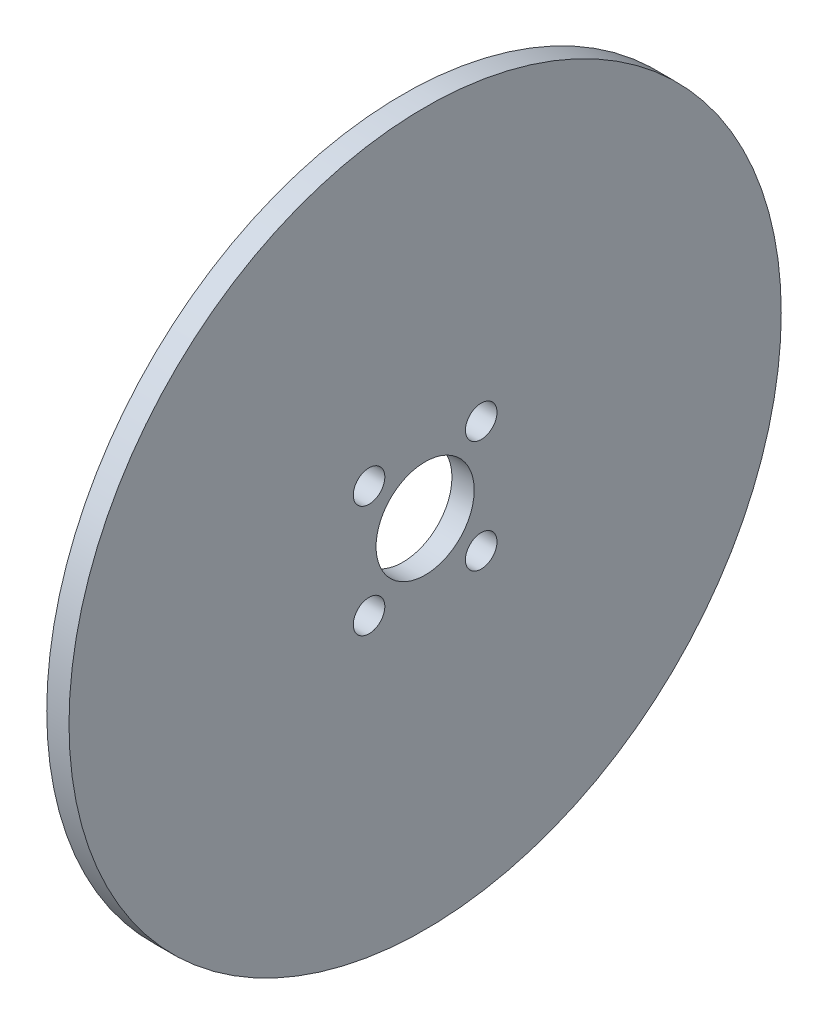
ISO-10303-21;
HEADER;
FILE_DESCRIPTION(('STEP AP214'),'2;1');
FILE_NAME('part.step','',(''),(''),'','','');
FILE_SCHEMA(('AUTOMOTIVE_DESIGN { 1 0 10303 214 1 1 1 1 }'));
ENDSEC;
DATA;
#1=APPLICATION_CONTEXT('core data for automotive mechanical design processes');
#2=APPLICATION_PROTOCOL_DEFINITION('international standard','automotive_design',2000,#1);
#3=PRODUCT_CONTEXT('',#1,'mechanical');
#4=PRODUCT('Part','Part','',(#3));
#5=PRODUCT_RELATED_PRODUCT_CATEGORY('part','',(#4));
#6=PRODUCT_DEFINITION_FORMATION('','',#4);
#7=PRODUCT_DEFINITION_CONTEXT('part definition',#1,'design');
#8=PRODUCT_DEFINITION('design','',#6,#7);
#9=PRODUCT_DEFINITION_SHAPE('','',#8);
#10=(LENGTH_UNIT() NAMED_UNIT(*) SI_UNIT(.MILLI.,.METRE.));
#11=(NAMED_UNIT(*) PLANE_ANGLE_UNIT() SI_UNIT($,.RADIAN.));
#12=(NAMED_UNIT(*) SI_UNIT($,.STERADIAN.) SOLID_ANGLE_UNIT());
#13=UNCERTAINTY_MEASURE_WITH_UNIT(LENGTH_MEASURE(1.E-05),#10,'distance_accuracy_value','');
#14=(GEOMETRIC_REPRESENTATION_CONTEXT(3) GLOBAL_UNCERTAINTY_ASSIGNED_CONTEXT((#13)) GLOBAL_UNIT_ASSIGNED_CONTEXT((#10,
#11,#12)) REPRESENTATION_CONTEXT('',''));
#15=CARTESIAN_POINT('',(0.,0.,0.));
#16=DIRECTION('',(0.,0.,1.));
#17=DIRECTION('',(1.,0.,0.));
#18=AXIS2_PLACEMENT_3D('',#15,#16,#17);
#19=CARTESIAN_POINT('',(3.175,0.,0.));
#20=DIRECTION('',(1.,0.,0.));
#21=DIRECTION('',(0.,0.,-1.));
#22=AXIS2_PLACEMENT_3D('',#19,#20,#21);
#23=PLANE('',#22);
#24=CARTESIAN_POINT('',(3.175,-8.,-8.));
#25=DIRECTION('',(1.,0.,0.));
#26=DIRECTION('',(0.,0.,-1.));
#27=AXIS2_PLACEMENT_3D('',#24,#25,#26);
#28=CIRCLE('',#27,2.25);
#29=CARTESIAN_POINT('',(3.175,-8.,-10.25));
#30=VERTEX_POINT('',#29);
#31=EDGE_CURVE('E65',#30,#30,#28,.T.);
#32=ORIENTED_EDGE('',*,*,#31,.F.);
#33=EDGE_LOOP('',(#32));
#34=FACE_BOUND('',#33,.T.);
#35=CARTESIAN_POINT('',(3.175,8.,-8.));
#36=DIRECTION('',(1.,0.,0.));
#37=DIRECTION('',(0.,0.,-1.));
#38=AXIS2_PLACEMENT_3D('',#35,#36,#37);
#39=CIRCLE('',#38,2.25);
#40=CARTESIAN_POINT('',(3.175,8.,-10.25));
#41=VERTEX_POINT('',#40);
#42=EDGE_CURVE('E71',#41,#41,#39,.T.);
#43=ORIENTED_EDGE('',*,*,#42,.F.);
#44=EDGE_LOOP('',(#43));
#45=FACE_BOUND('',#44,.T.);
#46=CARTESIAN_POINT('',(3.175,8.,8.));
#47=DIRECTION('',(1.,0.,0.));
#48=DIRECTION('',(0.,0.,-1.));
#49=AXIS2_PLACEMENT_3D('',#46,#47,#48);
#50=CIRCLE('',#49,2.25);
#51=CARTESIAN_POINT('',(3.175,8.,5.75));
#52=VERTEX_POINT('',#51);
#53=EDGE_CURVE('E59',#52,#52,#50,.T.);
#54=ORIENTED_EDGE('',*,*,#53,.F.);
#55=EDGE_LOOP('',(#54));
#56=FACE_BOUND('',#55,.T.);
#57=CARTESIAN_POINT('',(3.175,-8.,8.));
#58=DIRECTION('',(1.,0.,0.));
#59=DIRECTION('',(0.,0.,-1.));
#60=AXIS2_PLACEMENT_3D('',#57,#58,#59);
#61=CIRCLE('',#60,2.25);
#62=CARTESIAN_POINT('',(3.175,-8.,5.75));
#63=VERTEX_POINT('',#62);
#64=EDGE_CURVE('E56',#63,#63,#61,.T.);
#65=ORIENTED_EDGE('',*,*,#64,.F.);
#66=EDGE_LOOP('',(#65));
#67=FACE_BOUND('',#66,.T.);
#68=CARTESIAN_POINT('',(3.175,0.,0.));
#69=DIRECTION('',(1.,0.,0.));
#70=DIRECTION('',(0.,0.,-1.));
#71=AXIS2_PLACEMENT_3D('',#68,#69,#70);
#72=CIRCLE('',#71,50.8);
#73=CARTESIAN_POINT('',(3.175,0.,-50.8));
#74=VERTEX_POINT('',#73);
#75=EDGE_CURVE('E10',#74,#74,#72,.T.);
#76=ORIENTED_EDGE('',*,*,#75,.T.);
#77=EDGE_LOOP('',(#76));
#78=FACE_BOUND('',#77,.T.);
#79=CARTESIAN_POINT('',(3.175,0.,0.));
#80=DIRECTION('',(1.,0.,0.));
#81=DIRECTION('',(0.,0.,-1.));
#82=AXIS2_PLACEMENT_3D('',#79,#80,#81);
#83=CIRCLE('',#82,7.);
#84=CARTESIAN_POINT('',(3.175,0.,-7.));
#85=VERTEX_POINT('',#84);
#86=EDGE_CURVE('E48',#85,#85,#83,.T.);
#87=ORIENTED_EDGE('',*,*,#86,.F.);
#88=EDGE_LOOP('',(#87));
#89=FACE_BOUND('',#88,.T.);
#90=ADVANCED_FACE('F37',(#34,#45,#56,#67,#78,#89),#23,.T.);
#91=CARTESIAN_POINT('',(0.,0.,0.));
#92=DIRECTION('',(1.,0.,0.));
#93=DIRECTION('',(0.,0.,-1.));
#94=AXIS2_PLACEMENT_3D('',#91,#92,#93);
#95=PLANE('',#94);
#96=CARTESIAN_POINT('',(0.,-8.,-8.));
#97=DIRECTION('',(1.,0.,0.));
#98=DIRECTION('',(0.,0.,-1.));
#99=AXIS2_PLACEMENT_3D('',#96,#97,#98);
#100=CIRCLE('',#99,2.25);
#101=CARTESIAN_POINT('',(0.,-8.,-10.25));
#102=VERTEX_POINT('',#101);
#103=EDGE_CURVE('E62',#102,#102,#100,.T.);
#104=ORIENTED_EDGE('',*,*,#103,.T.);
#105=EDGE_LOOP('',(#104));
#106=FACE_BOUND('',#105,.T.);
#107=CARTESIAN_POINT('',(0.,8.,-8.));
#108=DIRECTION('',(1.,0.,0.));
#109=DIRECTION('',(0.,0.,-1.));
#110=AXIS2_PLACEMENT_3D('',#107,#108,#109);
#111=CIRCLE('',#110,2.25);
#112=CARTESIAN_POINT('',(0.,8.,-10.25));
#113=VERTEX_POINT('',#112);
#114=EDGE_CURVE('E68',#113,#113,#111,.T.);
#115=ORIENTED_EDGE('',*,*,#114,.T.);
#116=EDGE_LOOP('',(#115));
#117=FACE_BOUND('',#116,.T.);
#118=CARTESIAN_POINT('',(0.,8.,8.));
#119=DIRECTION('',(1.,0.,0.));
#120=DIRECTION('',(0.,0.,-1.));
#121=AXIS2_PLACEMENT_3D('',#118,#119,#120);
#122=CIRCLE('',#121,2.25);
#123=CARTESIAN_POINT('',(0.,8.,5.75));
#124=VERTEX_POINT('',#123);
#125=EDGE_CURVE('E74',#124,#124,#122,.T.);
#126=ORIENTED_EDGE('',*,*,#125,.T.);
#127=EDGE_LOOP('',(#126));
#128=FACE_BOUND('',#127,.T.);
#129=CARTESIAN_POINT('',(0.,-8.,8.));
#130=DIRECTION('',(1.,0.,0.));
#131=DIRECTION('',(0.,0.,-1.));
#132=AXIS2_PLACEMENT_3D('',#129,#130,#131);
#133=CIRCLE('',#132,2.25);
#134=CARTESIAN_POINT('',(0.,-8.,5.75));
#135=VERTEX_POINT('',#134);
#136=EDGE_CURVE('E53',#135,#135,#133,.T.);
#137=ORIENTED_EDGE('',*,*,#136,.T.);
#138=EDGE_LOOP('',(#137));
#139=FACE_BOUND('',#138,.T.);
#140=CARTESIAN_POINT('',(0.,0.,0.));
#141=DIRECTION('',(1.,0.,0.));
#142=DIRECTION('',(0.,0.,-1.));
#143=AXIS2_PLACEMENT_3D('',#140,#141,#142);
#144=CIRCLE('',#143,50.8);
#145=CARTESIAN_POINT('',(0.,0.,-50.8));
#146=VERTEX_POINT('',#145);
#147=EDGE_CURVE('E41',#146,#146,#144,.T.);
#148=ORIENTED_EDGE('',*,*,#147,.F.);
#149=EDGE_LOOP('',(#148));
#150=FACE_BOUND('',#149,.T.);
#151=CARTESIAN_POINT('',(0.,0.,0.));
#152=DIRECTION('',(1.,0.,0.));
#153=DIRECTION('',(0.,0.,-1.));
#154=AXIS2_PLACEMENT_3D('',#151,#152,#153);
#155=CIRCLE('',#154,7.);
#156=CARTESIAN_POINT('',(0.,0.,-7.));
#157=VERTEX_POINT('',#156);
#158=EDGE_CURVE('E50',#157,#157,#155,.T.);
#159=ORIENTED_EDGE('',*,*,#158,.T.);
#160=EDGE_LOOP('',(#159));
#161=FACE_BOUND('',#160,.T.);
#162=ADVANCED_FACE('F84',(#106,#117,#128,#139,#150,#161),#95,.F.);
#163=CARTESIAN_POINT('',(3.175,0.,0.));
#164=DIRECTION('',(-1.,0.,0.));
#165=DIRECTION('',(0.,0.,1.));
#166=AXIS2_PLACEMENT_3D('',#163,#164,#165);
#167=CYLINDRICAL_SURFACE('',#166,50.8);
#168=ORIENTED_EDGE('',*,*,#75,.F.);
#169=EDGE_LOOP('',(#168));
#170=FACE_BOUND('',#169,.T.);
#171=ORIENTED_EDGE('',*,*,#147,.T.);
#172=EDGE_LOOP('',(#171));
#173=FACE_BOUND('',#172,.T.);
#174=ADVANCED_FACE('F39',(#170,#173),#167,.T.);
#175=CARTESIAN_POINT('',(3.175,0.,0.));
#176=DIRECTION('',(-1.,0.,0.));
#177=DIRECTION('',(0.,0.,1.));
#178=AXIS2_PLACEMENT_3D('',#175,#176,#177);
#179=CYLINDRICAL_SURFACE('',#178,7.);
#180=ORIENTED_EDGE('',*,*,#86,.T.);
#181=EDGE_LOOP('',(#180));
#182=FACE_BOUND('',#181,.T.);
#183=ORIENTED_EDGE('',*,*,#158,.F.);
#184=EDGE_LOOP('',(#183));
#185=FACE_BOUND('',#184,.T.);
#186=ADVANCED_FACE('F91',(#182,#185),#179,.F.);
#187=CARTESIAN_POINT('',(0.,-8.,8.));
#188=DIRECTION('',(1.,0.,0.));
#189=DIRECTION('',(0.,0.,-1.));
#190=AXIS2_PLACEMENT_3D('',#187,#188,#189);
#191=CYLINDRICAL_SURFACE('',#190,2.25);
#192=ORIENTED_EDGE('',*,*,#136,.F.);
#193=EDGE_LOOP('',(#192));
#194=FACE_BOUND('',#193,.T.);
#195=ORIENTED_EDGE('',*,*,#64,.T.);
#196=EDGE_LOOP('',(#195));
#197=FACE_BOUND('',#196,.T.);
#198=ADVANCED_FACE('F94',(#194,#197),#191,.F.);
#199=CARTESIAN_POINT('',(0.,8.,8.));
#200=DIRECTION('',(1.,0.,0.));
#201=DIRECTION('',(0.,0.,-1.));
#202=AXIS2_PLACEMENT_3D('',#199,#200,#201);
#203=CYLINDRICAL_SURFACE('',#202,2.25);
#204=ORIENTED_EDGE('',*,*,#125,.F.);
#205=EDGE_LOOP('',(#204));
#206=FACE_BOUND('',#205,.T.);
#207=ORIENTED_EDGE('',*,*,#53,.T.);
#208=EDGE_LOOP('',(#207));
#209=FACE_BOUND('',#208,.T.);
#210=ADVANCED_FACE('F80',(#206,#209),#203,.F.);
#211=CARTESIAN_POINT('',(0.,8.,-8.));
#212=DIRECTION('',(1.,0.,0.));
#213=DIRECTION('',(0.,0.,-1.));
#214=AXIS2_PLACEMENT_3D('',#211,#212,#213);
#215=CYLINDRICAL_SURFACE('',#214,2.25);
#216=ORIENTED_EDGE('',*,*,#114,.F.);
#217=EDGE_LOOP('',(#216));
#218=FACE_BOUND('',#217,.T.);
#219=ORIENTED_EDGE('',*,*,#42,.T.);
#220=EDGE_LOOP('',(#219));
#221=FACE_BOUND('',#220,.T.);
#222=ADVANCED_FACE('F112',(#218,#221),#215,.F.);
#223=CARTESIAN_POINT('',(0.,-8.,-8.));
#224=DIRECTION('',(1.,0.,0.));
#225=DIRECTION('',(0.,0.,-1.));
#226=AXIS2_PLACEMENT_3D('',#223,#224,#225);
#227=CYLINDRICAL_SURFACE('',#226,2.25);
#228=ORIENTED_EDGE('',*,*,#103,.F.);
#229=EDGE_LOOP('',(#228));
#230=FACE_BOUND('',#229,.T.);
#231=ORIENTED_EDGE('',*,*,#31,.T.);
#232=EDGE_LOOP('',(#231));
#233=FACE_BOUND('',#232,.T.);
#234=ADVANCED_FACE('F109',(#230,#233),#227,.F.);
#235=CLOSED_SHELL('',(#90,#162,#174,#186,#198,#210,#222,#234));
#236=MANIFOLD_SOLID_BREP('B2',#235);
#237=ADVANCED_BREP_SHAPE_REPRESENTATION('',(#18,#236),#14);
#238=SHAPE_DEFINITION_REPRESENTATION(#9,#237);
ENDSEC;
END-ISO-10303-21;
